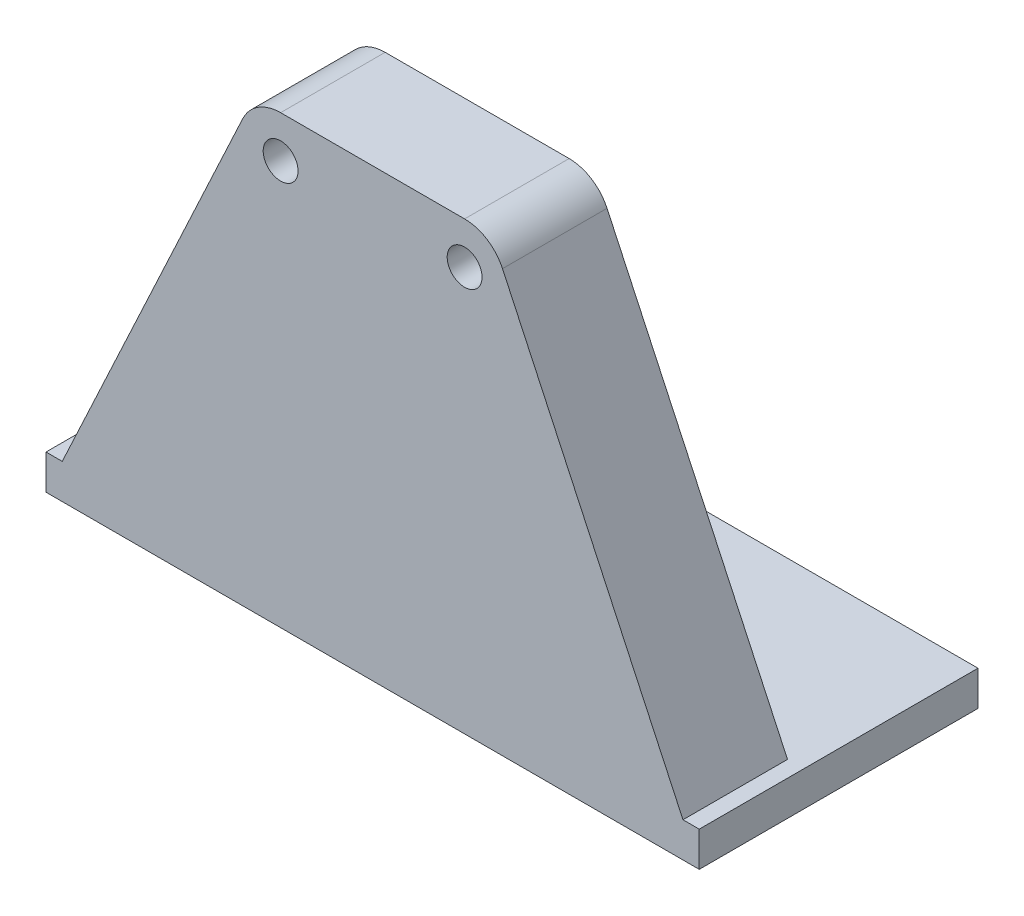
ISO-10303-21;
HEADER;
FILE_DESCRIPTION(('STEP AP214'),'2;1');
FILE_NAME('part.step','',(''),(''),'','','');
FILE_SCHEMA(('AUTOMOTIVE_DESIGN { 1 0 10303 214 1 1 1 1 }'));
ENDSEC;
DATA;
#1=APPLICATION_CONTEXT('core data for automotive mechanical design processes');
#2=APPLICATION_PROTOCOL_DEFINITION('international standard','automotive_design',2000,#1);
#3=PRODUCT_CONTEXT('',#1,'mechanical');
#4=PRODUCT('Part','Part','',(#3));
#5=PRODUCT_RELATED_PRODUCT_CATEGORY('part','',(#4));
#6=PRODUCT_DEFINITION_FORMATION('','',#4);
#7=PRODUCT_DEFINITION_CONTEXT('part definition',#1,'design');
#8=PRODUCT_DEFINITION('design','',#6,#7);
#9=PRODUCT_DEFINITION_SHAPE('','',#8);
#10=(LENGTH_UNIT() NAMED_UNIT(*) SI_UNIT(.MILLI.,.METRE.));
#11=(NAMED_UNIT(*) PLANE_ANGLE_UNIT() SI_UNIT($,.RADIAN.));
#12=(NAMED_UNIT(*) SI_UNIT($,.STERADIAN.) SOLID_ANGLE_UNIT());
#13=UNCERTAINTY_MEASURE_WITH_UNIT(LENGTH_MEASURE(1.E-05),#10,'distance_accuracy_value','');
#14=(GEOMETRIC_REPRESENTATION_CONTEXT(3) GLOBAL_UNCERTAINTY_ASSIGNED_CONTEXT((#13)) GLOBAL_UNIT_ASSIGNED_CONTEXT((#10,
#11,#12)) REPRESENTATION_CONTEXT('',''));
#15=CARTESIAN_POINT('',(0.,0.,0.));
#16=DIRECTION('',(0.,0.,1.));
#17=DIRECTION('',(1.,0.,0.));
#18=AXIS2_PLACEMENT_3D('',#15,#16,#17);
#19=CARTESIAN_POINT('',(38.1419809210956,36.83,9.525));
#20=DIRECTION('',(0.,0.,-1.));
#21=DIRECTION('',(-1.,0.,0.));
#22=AXIS2_PLACEMENT_3D('',#19,#20,#21);
#23=PLANE('',#22);
#24=DIRECTION('',(-0.422618261740697,-0.906307787036651,0.));
#25=VECTOR('',#24,1.);
#26=CARTESIAN_POINT('',(0.,0.,9.525));
#27=LINE('',#26,#25);
#28=CARTESIAN_POINT('',(17.9249482524859,38.4401755772321,9.525));
#29=VERTEX_POINT('',#28);
#30=CARTESIAN_POINT('',(1.48052681464211,3.175,9.525));
#31=VERTEX_POINT('',#30);
#32=EDGE_CURVE('E112',#29,#31,#27,.T.);
#33=ORIENTED_EDGE('',*,*,#32,.T.);
#34=DIRECTION('',(-1.,0.,0.));
#35=VECTOR('',#34,1.);
#36=CARTESIAN_POINT('',(0.,3.175,9.525));
#37=LINE('',#36,#35);
#38=CARTESIAN_POINT('',(0.,3.175,9.525));
#39=VERTEX_POINT('',#38);
#40=EDGE_CURVE('E173',#31,#39,#37,.T.);
#41=ORIENTED_EDGE('',*,*,#40,.T.);
#42=DIRECTION('',(0.,-1.,0.));
#43=VECTOR('',#42,1.);
#44=CARTESIAN_POINT('',(0.,0.,9.525));
#45=LINE('',#44,#43);
#46=CARTESIAN_POINT('',(0.,0.,9.525));
#47=VERTEX_POINT('',#46);
#48=EDGE_CURVE('E55',#39,#47,#45,.T.);
#49=ORIENTED_EDGE('',*,*,#48,.T.);
#50=DIRECTION('',(1.,0.,0.));
#51=VECTOR('',#50,1.);
#52=CARTESIAN_POINT('',(0.,0.,9.525));
#53=LINE('',#52,#51);
#54=CARTESIAN_POINT('',(59.5199618421911,0.,9.525));
#55=VERTEX_POINT('',#54);
#56=EDGE_CURVE('E128',#47,#55,#53,.T.);
#57=ORIENTED_EDGE('',*,*,#56,.T.);
#58=DIRECTION('',(0.,1.,0.));
#59=VECTOR('',#58,1.);
#60=CARTESIAN_POINT('',(59.5199618421911,0.,9.525));
#61=LINE('',#60,#59);
#62=CARTESIAN_POINT('',(59.5199618421911,3.175,9.525));
#63=VERTEX_POINT('',#62);
#64=EDGE_CURVE('E149',#55,#63,#61,.T.);
#65=ORIENTED_EDGE('',*,*,#64,.T.);
#66=CARTESIAN_POINT('',(58.039435027549,3.17499999999999,9.525));
#67=VERTEX_POINT('',#66);
#68=EDGE_CURVE('E166',#63,#67,#37,.T.);
#69=ORIENTED_EDGE('',*,*,#68,.T.);
#70=DIRECTION('',(-0.422618261740697,0.906307787036651,0.));
#71=VECTOR('',#70,1.);
#72=CARTESIAN_POINT('',(41.5950135897052,38.4401755772321,9.525));
#73=LINE('',#72,#71);
#74=CARTESIAN_POINT('',(41.5950135897052,38.4401755772321,9.525));
#75=VERTEX_POINT('',#74);
#76=EDGE_CURVE('E89',#67,#75,#73,.T.);
#77=ORIENTED_EDGE('',*,*,#76,.T.);
#78=CARTESIAN_POINT('',(38.1419809210956,36.83,9.525));
#79=DIRECTION('',(0.,0.,1.));
#80=DIRECTION('',(-1.,0.,0.));
#81=AXIS2_PLACEMENT_3D('',#78,#79,#80);
#82=CIRCLE('',#81,3.81);
#83=CARTESIAN_POINT('',(38.1419809210956,40.64,9.525));
#84=VERTEX_POINT('',#83);
#85=EDGE_CURVE('E102',#75,#84,#82,.T.);
#86=ORIENTED_EDGE('',*,*,#85,.T.);
#87=DIRECTION('',(-1.,0.,0.));
#88=VECTOR('',#87,1.);
#89=CARTESIAN_POINT('',(21.3779809210956,40.64,9.525));
#90=LINE('',#89,#88);
#91=CARTESIAN_POINT('',(21.3779809210956,40.64,9.525));
#92=VERTEX_POINT('',#91);
#93=EDGE_CURVE('E96',#84,#92,#90,.T.);
#94=ORIENTED_EDGE('',*,*,#93,.T.);
#95=CARTESIAN_POINT('',(21.3779809210956,36.83,9.525));
#96=DIRECTION('',(0.,0.,1.));
#97=DIRECTION('',(-1.,0.,0.));
#98=AXIS2_PLACEMENT_3D('',#95,#96,#97);
#99=CIRCLE('',#98,3.81000000000001);
#100=EDGE_CURVE('E100',#92,#29,#99,.T.);
#101=ORIENTED_EDGE('',*,*,#100,.T.);
#102=EDGE_LOOP('',(#33,#41,#49,#57,#65,#69,#77,#86,#94,#101));
#103=FACE_BOUND('',#102,.T.);
#104=CARTESIAN_POINT('',(21.3779809210956,36.83,9.525));
#105=DIRECTION('',(0.,0.,1.));
#106=DIRECTION('',(1.,0.,0.));
#107=AXIS2_PLACEMENT_3D('',#104,#105,#106);
#108=CIRCLE('',#107,1.5875);
#109=CARTESIAN_POINT('',(22.9654809210956,36.83,9.525));
#110=VERTEX_POINT('',#109);
#111=EDGE_CURVE('E121',#110,#110,#108,.T.);
#112=ORIENTED_EDGE('',*,*,#111,.F.);
#113=EDGE_LOOP('',(#112));
#114=FACE_BOUND('',#113,.T.);
#115=CARTESIAN_POINT('',(38.1419809210956,36.83,9.525));
#116=DIRECTION('',(0.,0.,1.));
#117=DIRECTION('',(1.,0.,0.));
#118=AXIS2_PLACEMENT_3D('',#115,#116,#117);
#119=CIRCLE('',#118,1.5875);
#120=CARTESIAN_POINT('',(39.7294809210956,36.83,9.525));
#121=VERTEX_POINT('',#120);
#122=EDGE_CURVE('E186',#121,#121,#119,.T.);
#123=ORIENTED_EDGE('',*,*,#122,.F.);
#124=EDGE_LOOP('',(#123));
#125=FACE_BOUND('',#124,.T.);
#126=ADVANCED_FACE('F38',(#103,#114,#125),#23,.F.);
#127=CARTESIAN_POINT('',(38.1419809210956,36.83,0.));
#128=DIRECTION('',(0.,0.,-1.));
#129=DIRECTION('',(-1.,0.,0.));
#130=AXIS2_PLACEMENT_3D('',#127,#128,#129);
#131=PLANE('',#130);
#132=DIRECTION('',(1.,0.,0.));
#133=VECTOR('',#132,1.);
#134=CARTESIAN_POINT('',(38.1419809210956,3.175,0.));
#135=LINE('',#134,#133);
#136=CARTESIAN_POINT('',(1.48052681464211,3.175,0.));
#137=VERTEX_POINT('',#136);
#138=CARTESIAN_POINT('',(58.039435027549,3.175,0.));
#139=VERTEX_POINT('',#138);
#140=EDGE_CURVE('E178',#137,#139,#135,.T.);
#141=ORIENTED_EDGE('',*,*,#140,.F.);
#142=DIRECTION('',(-0.422618261740697,-0.906307787036651,0.));
#143=VECTOR('',#142,1.);
#144=CARTESIAN_POINT('',(0.,0.,0.));
#145=LINE('',#144,#143);
#146=CARTESIAN_POINT('',(17.9249482524859,38.4401755772321,0.));
#147=VERTEX_POINT('',#146);
#148=EDGE_CURVE('E125',#147,#137,#145,.T.);
#149=ORIENTED_EDGE('',*,*,#148,.F.);
#150=CARTESIAN_POINT('',(21.3779809210956,36.83,0.));
#151=DIRECTION('',(0.,0.,1.));
#152=DIRECTION('',(-1.,0.,0.));
#153=AXIS2_PLACEMENT_3D('',#150,#151,#152);
#154=CIRCLE('',#153,3.81000000000001);
#155=CARTESIAN_POINT('',(21.3779809210956,40.64,0.));
#156=VERTEX_POINT('',#155);
#157=EDGE_CURVE('E81',#156,#147,#154,.T.);
#158=ORIENTED_EDGE('',*,*,#157,.F.);
#159=DIRECTION('',(-1.,0.,0.));
#160=VECTOR('',#159,1.);
#161=CARTESIAN_POINT('',(21.3779809210956,40.64,0.));
#162=LINE('',#161,#160);
#163=CARTESIAN_POINT('',(38.1419809210956,40.64,0.));
#164=VERTEX_POINT('',#163);
#165=EDGE_CURVE('E74',#164,#156,#162,.T.);
#166=ORIENTED_EDGE('',*,*,#165,.F.);
#167=CARTESIAN_POINT('',(38.1419809210956,36.83,0.));
#168=DIRECTION('',(0.,0.,1.));
#169=DIRECTION('',(-1.,0.,0.));
#170=AXIS2_PLACEMENT_3D('',#167,#168,#169);
#171=CIRCLE('',#170,3.81);
#172=CARTESIAN_POINT('',(41.5950135897052,38.4401755772321,0.));
#173=VERTEX_POINT('',#172);
#174=EDGE_CURVE('E120',#173,#164,#171,.T.);
#175=ORIENTED_EDGE('',*,*,#174,.F.);
#176=DIRECTION('',(-0.422618261740697,0.906307787036651,0.));
#177=VECTOR('',#176,1.);
#178=CARTESIAN_POINT('',(41.5950135897052,38.4401755772321,0.));
#179=LINE('',#178,#177);
#180=EDGE_CURVE('E118',#139,#173,#179,.T.);
#181=ORIENTED_EDGE('',*,*,#180,.F.);
#182=EDGE_LOOP('',(#141,#149,#158,#166,#175,#181));
#183=FACE_BOUND('',#182,.T.);
#184=CARTESIAN_POINT('',(21.3779809210956,36.83,0.));
#185=DIRECTION('',(0.,0.,1.));
#186=DIRECTION('',(1.,0.,0.));
#187=AXIS2_PLACEMENT_3D('',#184,#185,#186);
#188=CIRCLE('',#187,1.5875);
#189=CARTESIAN_POINT('',(22.9654809210956,36.83,0.));
#190=VERTEX_POINT('',#189);
#191=EDGE_CURVE('E189',#190,#190,#188,.T.);
#192=ORIENTED_EDGE('',*,*,#191,.T.);
#193=EDGE_LOOP('',(#192));
#194=FACE_BOUND('',#193,.T.);
#195=CARTESIAN_POINT('',(38.1419809210956,36.83,0.));
#196=DIRECTION('',(0.,0.,1.));
#197=DIRECTION('',(1.,0.,0.));
#198=AXIS2_PLACEMENT_3D('',#195,#196,#197);
#199=CIRCLE('',#198,1.5875);
#200=CARTESIAN_POINT('',(39.7294809210956,36.83,0.));
#201=VERTEX_POINT('',#200);
#202=EDGE_CURVE('E185',#201,#201,#199,.T.);
#203=ORIENTED_EDGE('',*,*,#202,.T.);
#204=EDGE_LOOP('',(#203));
#205=FACE_BOUND('',#204,.T.);
#206=ADVANCED_FACE('F223',(#183,#194,#205),#131,.T.);
#207=CARTESIAN_POINT('',(0.,0.,9.525));
#208=DIRECTION('',(0.,1.,0.));
#209=DIRECTION('',(0.,0.,1.));
#210=AXIS2_PLACEMENT_3D('',#207,#208,#209);
#211=PLANE('',#210);
#212=DIRECTION('',(0.,0.,-1.));
#213=VECTOR('',#212,1.);
#214=CARTESIAN_POINT('',(0.,0.,9.525));
#215=LINE('',#214,#213);
#216=CARTESIAN_POINT('',(0.,0.,-15.875));
#217=VERTEX_POINT('',#216);
#218=EDGE_CURVE('E114',#47,#217,#215,.T.);
#219=ORIENTED_EDGE('',*,*,#218,.T.);
#220=DIRECTION('',(1.,0.,0.));
#221=VECTOR('',#220,1.);
#222=CARTESIAN_POINT('',(0.,0.,-15.875));
#223=LINE('',#222,#221);
#224=CARTESIAN_POINT('',(59.5199618421911,0.,-15.875));
#225=VERTEX_POINT('',#224);
#226=EDGE_CURVE('E159',#217,#225,#223,.T.);
#227=ORIENTED_EDGE('',*,*,#226,.T.);
#228=DIRECTION('',(0.,0.,-1.));
#229=VECTOR('',#228,1.);
#230=CARTESIAN_POINT('',(59.5199618421911,0.,9.525));
#231=LINE('',#230,#229);
#232=EDGE_CURVE('E47',#55,#225,#231,.T.);
#233=ORIENTED_EDGE('',*,*,#232,.F.);
#234=ORIENTED_EDGE('',*,*,#56,.F.);
#235=EDGE_LOOP('',(#219,#227,#233,#234));
#236=FACE_BOUND('',#235,.T.);
#237=ADVANCED_FACE('F40',(#236),#211,.F.);
#238=CARTESIAN_POINT('',(41.5950135897052,38.4401755772321,9.525));
#239=DIRECTION('',(-0.906307787036651,-0.422618261740697,0.));
#240=DIRECTION('',(0.422618261740697,-0.906307787036651,0.));
#241=AXIS2_PLACEMENT_3D('',#238,#239,#240);
#242=PLANE('',#241);
#243=ORIENTED_EDGE('',*,*,#76,.F.);
#244=DIRECTION('',(0.,0.,-1.));
#245=VECTOR('',#244,1.);
#246=CARTESIAN_POINT('',(58.039435027549,3.175,9.525));
#247=LINE('',#246,#245);
#248=EDGE_CURVE('E182',#67,#139,#247,.T.);
#249=ORIENTED_EDGE('',*,*,#248,.T.);
#250=ORIENTED_EDGE('',*,*,#180,.T.);
#251=DIRECTION('',(0.,0.,-1.));
#252=VECTOR('',#251,1.);
#253=CARTESIAN_POINT('',(41.5950135897052,38.4401755772321,9.525));
#254=LINE('',#253,#252);
#255=EDGE_CURVE('E133',#75,#173,#254,.T.);
#256=ORIENTED_EDGE('',*,*,#255,.F.);
#257=EDGE_LOOP('',(#243,#249,#250,#256));
#258=FACE_BOUND('',#257,.T.);
#259=ADVANCED_FACE('F221',(#258),#242,.F.);
#260=CARTESIAN_POINT('',(38.1419809210956,36.83,9.525));
#261=DIRECTION('',(0.,0.,-1.));
#262=DIRECTION('',(-1.,0.,0.));
#263=AXIS2_PLACEMENT_3D('',#260,#261,#262);
#264=CYLINDRICAL_SURFACE('',#263,3.81);
#265=ORIENTED_EDGE('',*,*,#174,.T.);
#266=DIRECTION('',(0.,0.,-1.));
#267=VECTOR('',#266,1.);
#268=CARTESIAN_POINT('',(38.1419809210956,40.64,9.525));
#269=LINE('',#268,#267);
#270=EDGE_CURVE('E107',#84,#164,#269,.T.);
#271=ORIENTED_EDGE('',*,*,#270,.F.);
#272=ORIENTED_EDGE('',*,*,#85,.F.);
#273=ORIENTED_EDGE('',*,*,#255,.T.);
#274=EDGE_LOOP('',(#265,#271,#272,#273));
#275=FACE_BOUND('',#274,.T.);
#276=ADVANCED_FACE('F226',(#275),#264,.T.);
#277=CARTESIAN_POINT('',(21.3779809210956,40.64,9.525));
#278=DIRECTION('',(0.,-1.,0.));
#279=DIRECTION('',(1.,0.,0.));
#280=AXIS2_PLACEMENT_3D('',#277,#278,#279);
#281=PLANE('',#280);
#282=ORIENTED_EDGE('',*,*,#165,.T.);
#283=DIRECTION('',(0.,0.,-1.));
#284=VECTOR('',#283,1.);
#285=CARTESIAN_POINT('',(21.3779809210956,40.64,9.525));
#286=LINE('',#285,#284);
#287=EDGE_CURVE('E105',#92,#156,#286,.T.);
#288=ORIENTED_EDGE('',*,*,#287,.F.);
#289=ORIENTED_EDGE('',*,*,#93,.F.);
#290=ORIENTED_EDGE('',*,*,#270,.T.);
#291=EDGE_LOOP('',(#282,#288,#289,#290));
#292=FACE_BOUND('',#291,.T.);
#293=ADVANCED_FACE('F106',(#292),#281,.F.);
#294=CARTESIAN_POINT('',(21.3779809210956,36.83,9.525));
#295=DIRECTION('',(0.,0.,-1.));
#296=DIRECTION('',(-1.,0.,0.));
#297=AXIS2_PLACEMENT_3D('',#294,#295,#296);
#298=CYLINDRICAL_SURFACE('',#297,3.81000000000001);
#299=ORIENTED_EDGE('',*,*,#157,.T.);
#300=DIRECTION('',(0.,0.,-1.));
#301=VECTOR('',#300,1.);
#302=CARTESIAN_POINT('',(17.9249482524859,38.4401755772321,9.525));
#303=LINE('',#302,#301);
#304=EDGE_CURVE('E108',#29,#147,#303,.T.);
#305=ORIENTED_EDGE('',*,*,#304,.F.);
#306=ORIENTED_EDGE('',*,*,#100,.F.);
#307=ORIENTED_EDGE('',*,*,#287,.T.);
#308=EDGE_LOOP('',(#299,#305,#306,#307));
#309=FACE_BOUND('',#308,.T.);
#310=ADVANCED_FACE('F110',(#309),#298,.T.);
#311=CARTESIAN_POINT('',(0.,0.,9.525));
#312=DIRECTION('',(0.906307787036651,-0.422618261740697,0.));
#313=DIRECTION('',(0.422618261740697,0.906307787036651,0.));
#314=AXIS2_PLACEMENT_3D('',#311,#312,#313);
#315=PLANE('',#314);
#316=ORIENTED_EDGE('',*,*,#148,.T.);
#317=DIRECTION('',(0.,0.,1.));
#318=VECTOR('',#317,1.);
#319=CARTESIAN_POINT('',(1.48052681464211,3.175,9.525));
#320=LINE('',#319,#318);
#321=EDGE_CURVE('E11',#137,#31,#320,.T.);
#322=ORIENTED_EDGE('',*,*,#321,.T.);
#323=ORIENTED_EDGE('',*,*,#32,.F.);
#324=ORIENTED_EDGE('',*,*,#304,.T.);
#325=EDGE_LOOP('',(#316,#322,#323,#324));
#326=FACE_BOUND('',#325,.T.);
#327=ADVANCED_FACE('F244',(#326),#315,.F.);
#328=CARTESIAN_POINT('',(21.3779809210956,36.83,9.525));
#329=DIRECTION('',(0.,0.,-1.));
#330=DIRECTION('',(-1.,0.,0.));
#331=AXIS2_PLACEMENT_3D('',#328,#329,#330);
#332=CYLINDRICAL_SURFACE('',#331,1.5875);
#333=ORIENTED_EDGE('',*,*,#111,.T.);
#334=EDGE_LOOP('',(#333));
#335=FACE_BOUND('',#334,.T.);
#336=ORIENTED_EDGE('',*,*,#191,.F.);
#337=EDGE_LOOP('',(#336));
#338=FACE_BOUND('',#337,.T.);
#339=ADVANCED_FACE('F241',(#335,#338),#332,.F.);
#340=CARTESIAN_POINT('',(38.1419809210956,36.83,9.525));
#341=DIRECTION('',(0.,0.,-1.));
#342=DIRECTION('',(-1.,0.,0.));
#343=AXIS2_PLACEMENT_3D('',#340,#341,#342);
#344=CYLINDRICAL_SURFACE('',#343,1.5875);
#345=ORIENTED_EDGE('',*,*,#122,.T.);
#346=EDGE_LOOP('',(#345));
#347=FACE_BOUND('',#346,.T.);
#348=ORIENTED_EDGE('',*,*,#202,.F.);
#349=EDGE_LOOP('',(#348));
#350=FACE_BOUND('',#349,.T.);
#351=ADVANCED_FACE('F265',(#347,#350),#344,.F.);
#352=CARTESIAN_POINT('',(0.,3.175,-15.875));
#353=DIRECTION('',(0.,1.,0.));
#354=DIRECTION('',(0.,0.,1.));
#355=AXIS2_PLACEMENT_3D('',#352,#353,#354);
#356=PLANE('',#355);
#357=ORIENTED_EDGE('',*,*,#248,.F.);
#358=ORIENTED_EDGE('',*,*,#68,.F.);
#359=DIRECTION('',(0.,0.,1.));
#360=VECTOR('',#359,1.);
#361=CARTESIAN_POINT('',(59.5199618421911,3.175,-15.875));
#362=LINE('',#361,#360);
#363=CARTESIAN_POINT('',(59.5199618421911,3.175,-15.875));
#364=VERTEX_POINT('',#363);
#365=EDGE_CURVE('E170',#364,#63,#362,.T.);
#366=ORIENTED_EDGE('',*,*,#365,.F.);
#367=DIRECTION('',(-1.,0.,0.));
#368=VECTOR('',#367,1.);
#369=CARTESIAN_POINT('',(0.,3.175,-15.875));
#370=LINE('',#369,#368);
#371=CARTESIAN_POINT('',(0.,3.175,-15.875));
#372=VERTEX_POINT('',#371);
#373=EDGE_CURVE('E162',#364,#372,#370,.T.);
#374=ORIENTED_EDGE('',*,*,#373,.T.);
#375=DIRECTION('',(0.,0.,1.));
#376=VECTOR('',#375,1.);
#377=CARTESIAN_POINT('',(0.,3.175,-15.875));
#378=LINE('',#377,#376);
#379=EDGE_CURVE('E175',#372,#39,#378,.T.);
#380=ORIENTED_EDGE('',*,*,#379,.T.);
#381=ORIENTED_EDGE('',*,*,#40,.F.);
#382=ORIENTED_EDGE('',*,*,#321,.F.);
#383=ORIENTED_EDGE('',*,*,#140,.T.);
#384=EDGE_LOOP('',(#357,#358,#366,#374,#380,#381,#382,#383));
#385=FACE_BOUND('',#384,.T.);
#386=ADVANCED_FACE('F216',(#385),#356,.T.);
#387=CARTESIAN_POINT('',(0.,0.,-15.875));
#388=DIRECTION('',(-1.,0.,0.));
#389=DIRECTION('',(0.,0.,1.));
#390=AXIS2_PLACEMENT_3D('',#387,#388,#389);
#391=PLANE('',#390);
#392=ORIENTED_EDGE('',*,*,#48,.F.);
#393=ORIENTED_EDGE('',*,*,#379,.F.);
#394=DIRECTION('',(0.,-1.,0.));
#395=VECTOR('',#394,1.);
#396=CARTESIAN_POINT('',(0.,0.,-15.875));
#397=LINE('',#396,#395);
#398=EDGE_CURVE('E164',#372,#217,#397,.T.);
#399=ORIENTED_EDGE('',*,*,#398,.T.);
#400=ORIENTED_EDGE('',*,*,#218,.F.);
#401=EDGE_LOOP('',(#392,#393,#399,#400));
#402=FACE_BOUND('',#401,.T.);
#403=ADVANCED_FACE('F277',(#402),#391,.T.);
#404=CARTESIAN_POINT('',(59.5199618421911,0.,-15.875));
#405=DIRECTION('',(1.,0.,0.));
#406=DIRECTION('',(0.,0.,-1.));
#407=AXIS2_PLACEMENT_3D('',#404,#405,#406);
#408=PLANE('',#407);
#409=ORIENTED_EDGE('',*,*,#64,.F.);
#410=ORIENTED_EDGE('',*,*,#232,.T.);
#411=DIRECTION('',(0.,1.,0.));
#412=VECTOR('',#411,1.);
#413=CARTESIAN_POINT('',(59.5199618421911,0.,-15.875));
#414=LINE('',#413,#412);
#415=EDGE_CURVE('E145',#225,#364,#414,.T.);
#416=ORIENTED_EDGE('',*,*,#415,.T.);
#417=ORIENTED_EDGE('',*,*,#365,.T.);
#418=EDGE_LOOP('',(#409,#410,#416,#417));
#419=FACE_BOUND('',#418,.T.);
#420=ADVANCED_FACE('F142',(#419),#408,.T.);
#421=CARTESIAN_POINT('',(0.,0.,-15.875));
#422=DIRECTION('',(0.,0.,-1.));
#423=DIRECTION('',(-1.,0.,0.));
#424=AXIS2_PLACEMENT_3D('',#421,#422,#423);
#425=PLANE('',#424);
#426=ORIENTED_EDGE('',*,*,#398,.F.);
#427=ORIENTED_EDGE('',*,*,#373,.F.);
#428=ORIENTED_EDGE('',*,*,#415,.F.);
#429=ORIENTED_EDGE('',*,*,#226,.F.);
#430=EDGE_LOOP('',(#426,#427,#428,#429));
#431=FACE_BOUND('',#430,.T.);
#432=ADVANCED_FACE('F158',(#431),#425,.T.);
#433=CLOSED_SHELL('',(#126,#206,#237,#259,#276,#293,#310,#327,#339,#351,#386,#403,#420,#432));
#434=MANIFOLD_SOLID_BREP('B2',#433);
#435=ADVANCED_BREP_SHAPE_REPRESENTATION('',(#18,#434),#14);
#436=SHAPE_DEFINITION_REPRESENTATION(#9,#435);
ENDSEC;
END-ISO-10303-21;
